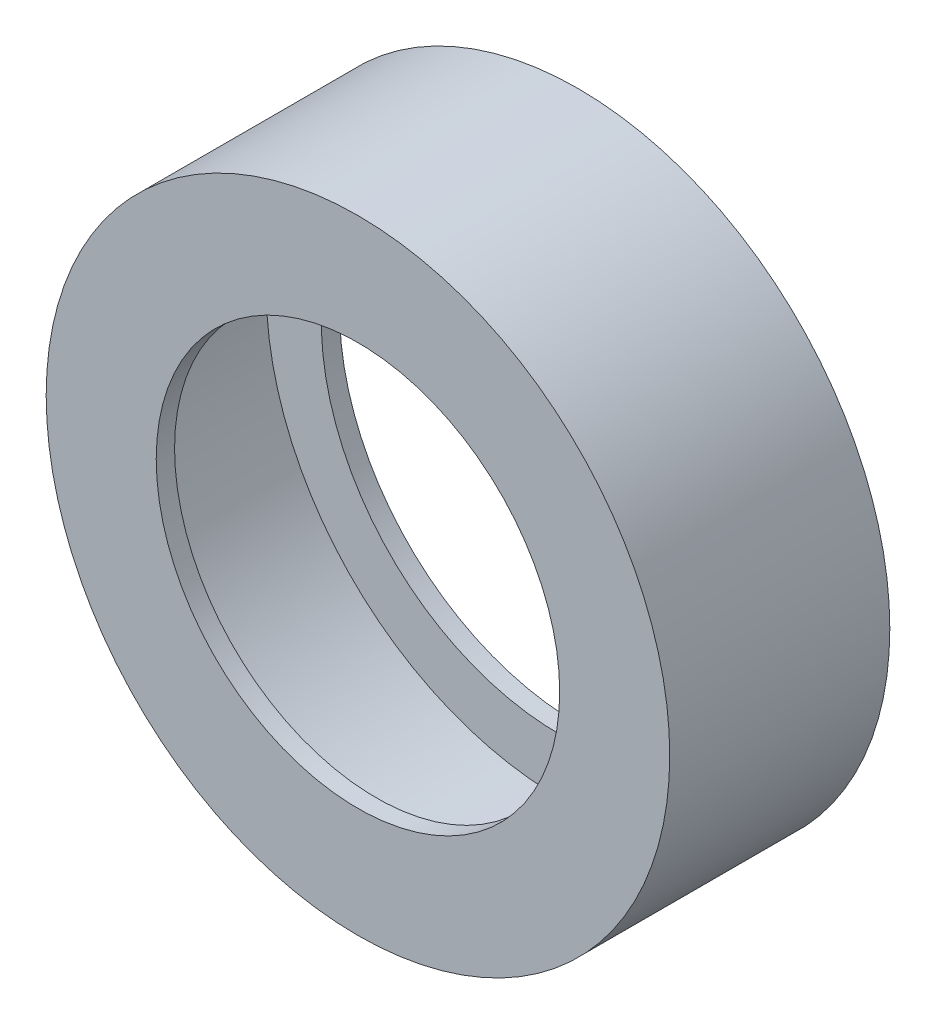
ISO-10303-21;
HEADER;
FILE_DESCRIPTION(('STEP AP214'),'2;1');
FILE_NAME('part.step','',(''),(''),'','','');
FILE_SCHEMA(('AUTOMOTIVE_DESIGN { 1 0 10303 214 1 1 1 1 }'));
ENDSEC;
DATA;
#1=APPLICATION_CONTEXT('core data for automotive mechanical design processes');
#2=APPLICATION_PROTOCOL_DEFINITION('international standard','automotive_design',2000,#1);
#3=PRODUCT_CONTEXT('',#1,'mechanical');
#4=PRODUCT('Part','Part','',(#3));
#5=PRODUCT_RELATED_PRODUCT_CATEGORY('part','',(#4));
#6=PRODUCT_DEFINITION_FORMATION('','',#4);
#7=PRODUCT_DEFINITION_CONTEXT('part definition',#1,'design');
#8=PRODUCT_DEFINITION('design','',#6,#7);
#9=PRODUCT_DEFINITION_SHAPE('','',#8);
#10=(LENGTH_UNIT() NAMED_UNIT(*) SI_UNIT(.MILLI.,.METRE.));
#11=(NAMED_UNIT(*) PLANE_ANGLE_UNIT() SI_UNIT($,.RADIAN.));
#12=(NAMED_UNIT(*) SI_UNIT($,.STERADIAN.) SOLID_ANGLE_UNIT());
#13=UNCERTAINTY_MEASURE_WITH_UNIT(LENGTH_MEASURE(1.E-05),#10,'distance_accuracy_value','');
#14=(GEOMETRIC_REPRESENTATION_CONTEXT(3) GLOBAL_UNCERTAINTY_ASSIGNED_CONTEXT((#13)) GLOBAL_UNIT_ASSIGNED_CONTEXT((#10,
#11,#12)) REPRESENTATION_CONTEXT('',''));
#15=CARTESIAN_POINT('',(0.,0.,0.));
#16=DIRECTION('',(0.,0.,1.));
#17=DIRECTION('',(1.,0.,0.));
#18=AXIS2_PLACEMENT_3D('',#15,#16,#17);
#19=CARTESIAN_POINT('',(0.,0.,0.));
#20=DIRECTION('',(0.,0.,1.));
#21=DIRECTION('',(1.,0.,0.));
#22=AXIS2_PLACEMENT_3D('',#19,#20,#21);
#23=CYLINDRICAL_SURFACE('',#22,8.);
#24=CARTESIAN_POINT('',(0.,0.,-5.50000000000001));
#25=DIRECTION('',(0.,0.,1.));
#26=DIRECTION('',(1.,0.,0.));
#27=AXIS2_PLACEMENT_3D('',#24,#25,#26);
#28=CIRCLE('',#27,8.);
#29=CARTESIAN_POINT('',(8.,0.,-5.50000000000001));
#30=VERTEX_POINT('',#29);
#31=EDGE_CURVE('E18',#30,#30,#28,.T.);
#32=ORIENTED_EDGE('',*,*,#31,.F.);
#33=EDGE_LOOP('',(#32));
#34=FACE_BOUND('',#33,.T.);
#35=CARTESIAN_POINT('',(0.,0.,-0.5));
#36=DIRECTION('',(0.,0.,1.));
#37=DIRECTION('',(1.,0.,0.));
#38=AXIS2_PLACEMENT_3D('',#35,#36,#37);
#39=CIRCLE('',#38,8.);
#40=CARTESIAN_POINT('',(8.,0.,-0.5));
#41=VERTEX_POINT('',#40);
#42=EDGE_CURVE('E40',#41,#41,#39,.F.);
#43=ORIENTED_EDGE('',*,*,#42,.F.);
#44=EDGE_LOOP('',(#43));
#45=FACE_BOUND('',#44,.T.);
#46=ADVANCED_FACE('F15',(#34,#45),#23,.F.);
#47=CARTESIAN_POINT('',(6.5,0.,-5.50000000000001));
#48=DIRECTION('',(0.,0.,1.));
#49=DIRECTION('',(1.,0.,0.));
#50=AXIS2_PLACEMENT_3D('',#47,#48,#49);
#51=PLANE('',#50);
#52=CARTESIAN_POINT('',(0.,0.,-5.50000000000001));
#53=DIRECTION('',(0.,0.,1.));
#54=DIRECTION('',(1.,0.,0.));
#55=AXIS2_PLACEMENT_3D('',#52,#53,#54);
#56=CIRCLE('',#55,6.50000000000001);
#57=CARTESIAN_POINT('',(6.50000000000001,0.,-5.50000000000001));
#58=VERTEX_POINT('',#57);
#59=EDGE_CURVE('E38',#58,#58,#56,.F.);
#60=ORIENTED_EDGE('',*,*,#59,.T.);
#61=EDGE_LOOP('',(#60));
#62=FACE_BOUND('',#61,.T.);
#63=ORIENTED_EDGE('',*,*,#31,.T.);
#64=EDGE_LOOP('',(#63));
#65=FACE_BOUND('',#64,.T.);
#66=ADVANCED_FACE('F47',(#62,#65),#51,.T.);
#67=CARTESIAN_POINT('',(8.,0.,-0.5));
#68=DIRECTION('',(0.,0.,-1.));
#69=DIRECTION('',(-1.,0.,0.));
#70=AXIS2_PLACEMENT_3D('',#67,#68,#69);
#71=PLANE('',#70);
#72=ORIENTED_EDGE('',*,*,#42,.T.);
#73=EDGE_LOOP('',(#72));
#74=FACE_BOUND('',#73,.T.);
#75=CARTESIAN_POINT('',(0.,0.,-0.5));
#76=DIRECTION('',(0.,0.,1.));
#77=DIRECTION('',(1.,0.,0.));
#78=AXIS2_PLACEMENT_3D('',#75,#76,#77);
#79=CIRCLE('',#78,5.50000000000001);
#80=CARTESIAN_POINT('',(5.50000000000001,0.,-0.5));
#81=VERTEX_POINT('',#80);
#82=EDGE_CURVE('E35',#81,#81,#79,.T.);
#83=ORIENTED_EDGE('',*,*,#82,.T.);
#84=EDGE_LOOP('',(#83));
#85=FACE_BOUND('',#84,.T.);
#86=ADVANCED_FACE('F55',(#74,#85),#71,.T.);
#87=CARTESIAN_POINT('',(0.,0.,0.));
#88=DIRECTION('',(0.,0.,1.));
#89=DIRECTION('',(1.,0.,0.));
#90=AXIS2_PLACEMENT_3D('',#87,#88,#89);
#91=CYLINDRICAL_SURFACE('',#90,6.50000000000001);
#92=ORIENTED_EDGE('',*,*,#59,.F.);
#93=EDGE_LOOP('',(#92));
#94=FACE_BOUND('',#93,.T.);
#95=CARTESIAN_POINT('',(0.,0.,-6.));
#96=DIRECTION('',(0.,0.,1.));
#97=DIRECTION('',(1.,0.,0.));
#98=AXIS2_PLACEMENT_3D('',#95,#96,#97);
#99=CIRCLE('',#98,6.50000000000001);
#100=CARTESIAN_POINT('',(6.50000000000001,0.,-6.));
#101=VERTEX_POINT('',#100);
#102=EDGE_CURVE('E32',#101,#101,#99,.T.);
#103=ORIENTED_EDGE('',*,*,#102,.F.);
#104=EDGE_LOOP('',(#103));
#105=FACE_BOUND('',#104,.T.);
#106=ADVANCED_FACE('F75',(#94,#105),#91,.F.);
#107=CARTESIAN_POINT('',(0.,0.,0.));
#108=DIRECTION('',(0.,0.,1.));
#109=DIRECTION('',(1.,0.,0.));
#110=AXIS2_PLACEMENT_3D('',#107,#108,#109);
#111=CYLINDRICAL_SURFACE('',#110,5.50000000000001);
#112=ORIENTED_EDGE('',*,*,#82,.F.);
#113=EDGE_LOOP('',(#112));
#114=FACE_BOUND('',#113,.T.);
#115=CARTESIAN_POINT('',(0.,0.,0.));
#116=DIRECTION('',(0.,0.,1.));
#117=DIRECTION('',(1.,0.,0.));
#118=AXIS2_PLACEMENT_3D('',#115,#116,#117);
#119=CIRCLE('',#118,5.50000000000001);
#120=CARTESIAN_POINT('',(5.50000000000001,0.,0.));
#121=VERTEX_POINT('',#120);
#122=EDGE_CURVE('E27',#121,#121,#119,.F.);
#123=ORIENTED_EDGE('',*,*,#122,.F.);
#124=EDGE_LOOP('',(#123));
#125=FACE_BOUND('',#124,.T.);
#126=ADVANCED_FACE('F71',(#114,#125),#111,.F.);
#127=CARTESIAN_POINT('',(8.5,0.,-6.));
#128=DIRECTION('',(0.,0.,-1.));
#129=DIRECTION('',(-1.,0.,0.));
#130=AXIS2_PLACEMENT_3D('',#127,#128,#129);
#131=PLANE('',#130);
#132=CARTESIAN_POINT('',(0.,0.,-6.));
#133=DIRECTION('',(0.,0.,1.));
#134=DIRECTION('',(1.,0.,0.));
#135=AXIS2_PLACEMENT_3D('',#132,#133,#134);
#136=CIRCLE('',#135,8.5);
#137=CARTESIAN_POINT('',(8.5,0.,-6.));
#138=VERTEX_POINT('',#137);
#139=EDGE_CURVE('E22',#138,#138,#136,.T.);
#140=ORIENTED_EDGE('',*,*,#139,.F.);
#141=EDGE_LOOP('',(#140));
#142=FACE_BOUND('',#141,.T.);
#143=ORIENTED_EDGE('',*,*,#102,.T.);
#144=EDGE_LOOP('',(#143));
#145=FACE_BOUND('',#144,.T.);
#146=ADVANCED_FACE('F64',(#142,#145),#131,.T.);
#147=CARTESIAN_POINT('',(5.50000000000001,0.,0.));
#148=DIRECTION('',(0.,0.,1.));
#149=DIRECTION('',(1.,0.,0.));
#150=AXIS2_PLACEMENT_3D('',#147,#148,#149);
#151=PLANE('',#150);
#152=ORIENTED_EDGE('',*,*,#122,.T.);
#153=EDGE_LOOP('',(#152));
#154=FACE_BOUND('',#153,.T.);
#155=CARTESIAN_POINT('',(0.,0.,0.));
#156=DIRECTION('',(0.,0.,1.));
#157=DIRECTION('',(1.,0.,0.));
#158=AXIS2_PLACEMENT_3D('',#155,#156,#157);
#159=CIRCLE('',#158,8.5);
#160=CARTESIAN_POINT('',(8.5,0.,0.));
#161=VERTEX_POINT('',#160);
#162=EDGE_CURVE('E10',#161,#161,#159,.F.);
#163=ORIENTED_EDGE('',*,*,#162,.F.);
#164=EDGE_LOOP('',(#163));
#165=FACE_BOUND('',#164,.T.);
#166=ADVANCED_FACE('F59',(#154,#165),#151,.T.);
#167=CARTESIAN_POINT('',(0.,0.,0.));
#168=DIRECTION('',(0.,0.,1.));
#169=DIRECTION('',(1.,0.,0.));
#170=AXIS2_PLACEMENT_3D('',#167,#168,#169);
#171=CYLINDRICAL_SURFACE('',#170,8.5);
#172=ORIENTED_EDGE('',*,*,#162,.T.);
#173=EDGE_LOOP('',(#172));
#174=FACE_BOUND('',#173,.T.);
#175=ORIENTED_EDGE('',*,*,#139,.T.);
#176=EDGE_LOOP('',(#175));
#177=FACE_BOUND('',#176,.T.);
#178=ADVANCED_FACE('F57',(#174,#177),#171,.T.);
#179=CLOSED_SHELL('',(#46,#66,#86,#106,#126,#146,#166,#178));
#180=MANIFOLD_SOLID_BREP('B1',#179);
#181=ADVANCED_BREP_SHAPE_REPRESENTATION('',(#18,#180),#14);
#182=SHAPE_DEFINITION_REPRESENTATION(#9,#181);
ENDSEC;
END-ISO-10303-21;
